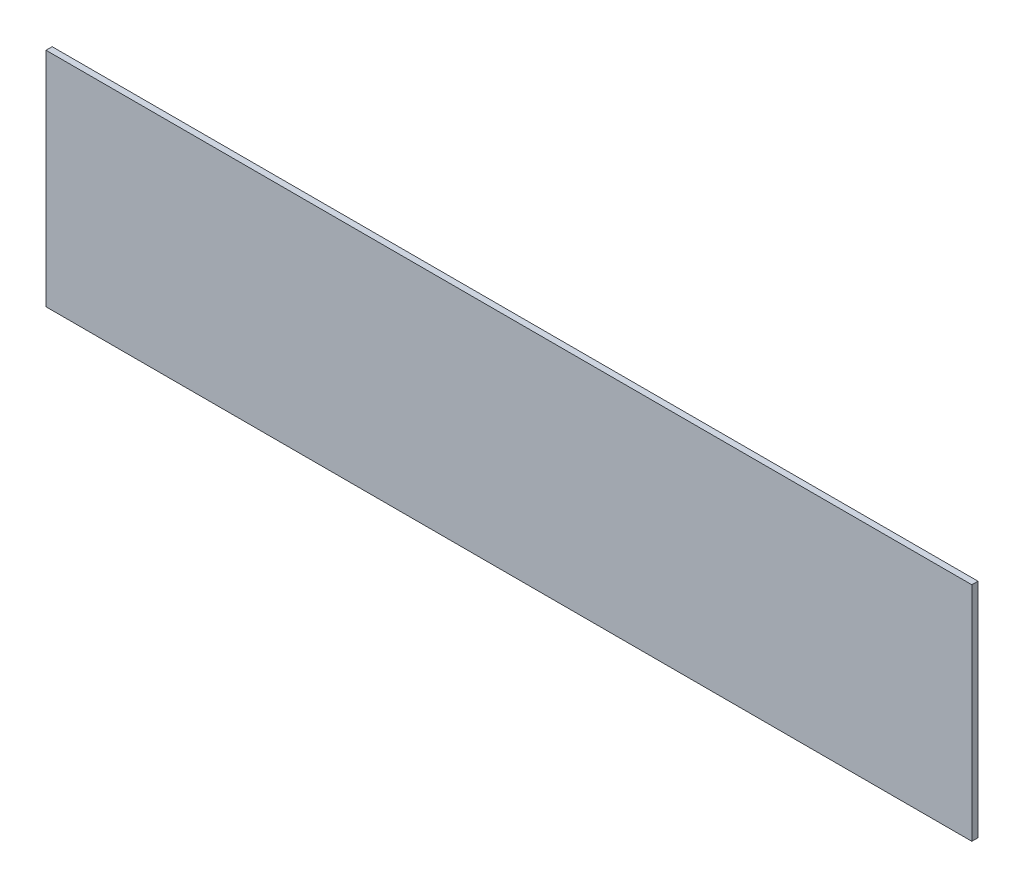
ISO-10303-21;
HEADER;
FILE_DESCRIPTION(('STEP AP214'),'2;1');
FILE_NAME('part.step','',(''),(''),'','','');
FILE_SCHEMA(('AUTOMOTIVE_DESIGN { 1 0 10303 214 1 1 1 1 }'));
ENDSEC;
DATA;
#1=APPLICATION_CONTEXT('core data for automotive mechanical design processes');
#2=APPLICATION_PROTOCOL_DEFINITION('international standard','automotive_design',2000,#1);
#3=PRODUCT_CONTEXT('',#1,'mechanical');
#4=PRODUCT('Part','Part','',(#3));
#5=PRODUCT_RELATED_PRODUCT_CATEGORY('part','',(#4));
#6=PRODUCT_DEFINITION_FORMATION('','',#4);
#7=PRODUCT_DEFINITION_CONTEXT('part definition',#1,'design');
#8=PRODUCT_DEFINITION('design','',#6,#7);
#9=PRODUCT_DEFINITION_SHAPE('','',#8);
#10=(LENGTH_UNIT() NAMED_UNIT(*) SI_UNIT(.MILLI.,.METRE.));
#11=(NAMED_UNIT(*) PLANE_ANGLE_UNIT() SI_UNIT($,.RADIAN.));
#12=(NAMED_UNIT(*) SI_UNIT($,.STERADIAN.) SOLID_ANGLE_UNIT());
#13=UNCERTAINTY_MEASURE_WITH_UNIT(LENGTH_MEASURE(1.E-05),#10,'distance_accuracy_value','');
#14=(GEOMETRIC_REPRESENTATION_CONTEXT(3) GLOBAL_UNCERTAINTY_ASSIGNED_CONTEXT((#13)) GLOBAL_UNIT_ASSIGNED_CONTEXT((#10,
#11,#12)) REPRESENTATION_CONTEXT('',''));
#15=CARTESIAN_POINT('',(0.,0.,0.));
#16=DIRECTION('',(0.,0.,1.));
#17=DIRECTION('',(1.,0.,0.));
#18=AXIS2_PLACEMENT_3D('',#15,#16,#17);
#19=CARTESIAN_POINT('',(-90.361242914173,53.3396271710853,3.175));
#20=DIRECTION('',(1.,0.,0.));
#21=DIRECTION('',(0.,1.,0.));
#22=AXIS2_PLACEMENT_3D('',#19,#20,#21);
#23=PLANE('',#22);
#24=DIRECTION('',(0.,-1.,0.));
#25=VECTOR('',#24,1.);
#26=CARTESIAN_POINT('',(-90.361242914173,53.3396271710853,0.));
#27=LINE('',#26,#25);
#28=CARTESIAN_POINT('',(-90.361242914173,53.3396271710853,0.));
#29=VERTEX_POINT('',#28);
#30=CARTESIAN_POINT('',(-90.361242914173,-60.9603728289147,0.));
#31=VERTEX_POINT('',#30);
#32=EDGE_CURVE('E95',#29,#31,#27,.T.);
#33=ORIENTED_EDGE('',*,*,#32,.T.);
#34=DIRECTION('',(0.,0.,-1.));
#35=VECTOR('',#34,1.);
#36=CARTESIAN_POINT('',(-90.361242914173,-60.9603728289147,3.175));
#37=LINE('',#36,#35);
#38=CARTESIAN_POINT('',(-90.361242914173,-60.9603728289147,3.175));
#39=VERTEX_POINT('',#38);
#40=EDGE_CURVE('E11',#39,#31,#37,.T.);
#41=ORIENTED_EDGE('',*,*,#40,.F.);
#42=DIRECTION('',(0.,-1.,0.));
#43=VECTOR('',#42,1.);
#44=CARTESIAN_POINT('',(-90.361242914173,53.3396271710853,3.175));
#45=LINE('',#44,#43);
#46=CARTESIAN_POINT('',(-90.361242914173,53.3396271710853,3.175));
#47=VERTEX_POINT('',#46);
#48=EDGE_CURVE('E83',#47,#39,#45,.T.);
#49=ORIENTED_EDGE('',*,*,#48,.F.);
#50=DIRECTION('',(0.,0.,-1.));
#51=VECTOR('',#50,1.);
#52=CARTESIAN_POINT('',(-90.361242914173,53.3396271710853,3.175));
#53=LINE('',#52,#51);
#54=EDGE_CURVE('E91',#47,#29,#53,.T.);
#55=ORIENTED_EDGE('',*,*,#54,.T.);
#56=EDGE_LOOP('',(#33,#41,#49,#55));
#57=FACE_BOUND('',#56,.T.);
#58=ADVANCED_FACE('F32',(#57),#23,.F.);
#59=CARTESIAN_POINT('',(-90.361242914173,-60.9603728289147,3.175));
#60=DIRECTION('',(0.,1.,0.));
#61=DIRECTION('',(0.,0.,1.));
#62=AXIS2_PLACEMENT_3D('',#59,#60,#61);
#63=PLANE('',#62);
#64=DIRECTION('',(1.,0.,0.));
#65=VECTOR('',#64,1.);
#66=CARTESIAN_POINT('',(-90.361242914173,-60.9603728289147,0.));
#67=LINE('',#66,#65);
#68=CARTESIAN_POINT('',(385.888757085827,-60.9603728289147,0.));
#69=VERTEX_POINT('',#68);
#70=EDGE_CURVE('E87',#31,#69,#67,.T.);
#71=ORIENTED_EDGE('',*,*,#70,.T.);
#72=DIRECTION('',(0.,0.,-1.));
#73=VECTOR('',#72,1.);
#74=CARTESIAN_POINT('',(385.888757085827,-60.9603728289147,3.175));
#75=LINE('',#74,#73);
#76=CARTESIAN_POINT('',(385.888757085827,-60.9603728289147,3.175));
#77=VERTEX_POINT('',#76);
#78=EDGE_CURVE('E40',#77,#69,#75,.T.);
#79=ORIENTED_EDGE('',*,*,#78,.F.);
#80=DIRECTION('',(1.,0.,0.));
#81=VECTOR('',#80,1.);
#82=CARTESIAN_POINT('',(-90.361242914173,-60.9603728289147,3.175));
#83=LINE('',#82,#81);
#84=EDGE_CURVE('E78',#39,#77,#83,.T.);
#85=ORIENTED_EDGE('',*,*,#84,.F.);
#86=ORIENTED_EDGE('',*,*,#40,.T.);
#87=EDGE_LOOP('',(#71,#79,#85,#86));
#88=FACE_BOUND('',#87,.T.);
#89=ADVANCED_FACE('F86',(#88),#63,.F.);
#90=CARTESIAN_POINT('',(385.888757085827,53.3396271710853,3.175));
#91=DIRECTION('',(-1.,0.,0.));
#92=DIRECTION('',(0.,0.,1.));
#93=AXIS2_PLACEMENT_3D('',#90,#91,#92);
#94=PLANE('',#93);
#95=DIRECTION('',(0.,1.,0.));
#96=VECTOR('',#95,1.);
#97=CARTESIAN_POINT('',(385.888757085827,53.3396271710853,0.));
#98=LINE('',#97,#96);
#99=CARTESIAN_POINT('',(385.888757085827,53.3396271710853,0.));
#100=VERTEX_POINT('',#99);
#101=EDGE_CURVE('E65',#69,#100,#98,.T.);
#102=ORIENTED_EDGE('',*,*,#101,.T.);
#103=DIRECTION('',(0.,0.,-1.));
#104=VECTOR('',#103,1.);
#105=CARTESIAN_POINT('',(385.888757085827,53.3396271710853,3.175));
#106=LINE('',#105,#104);
#107=CARTESIAN_POINT('',(385.888757085827,53.3396271710853,3.175));
#108=VERTEX_POINT('',#107);
#109=EDGE_CURVE('E88',#108,#100,#106,.T.);
#110=ORIENTED_EDGE('',*,*,#109,.F.);
#111=DIRECTION('',(0.,1.,0.));
#112=VECTOR('',#111,1.);
#113=CARTESIAN_POINT('',(385.888757085827,53.3396271710853,3.175));
#114=LINE('',#113,#112);
#115=EDGE_CURVE('E81',#77,#108,#114,.T.);
#116=ORIENTED_EDGE('',*,*,#115,.F.);
#117=ORIENTED_EDGE('',*,*,#78,.T.);
#118=EDGE_LOOP('',(#102,#110,#116,#117));
#119=FACE_BOUND('',#118,.T.);
#120=ADVANCED_FACE('F89',(#119),#94,.F.);
#121=CARTESIAN_POINT('',(-90.361242914173,53.3396271710853,3.175));
#122=DIRECTION('',(0.,-1.,0.));
#123=DIRECTION('',(0.,0.,-1.));
#124=AXIS2_PLACEMENT_3D('',#121,#122,#123);
#125=PLANE('',#124);
#126=DIRECTION('',(-1.,0.,0.));
#127=VECTOR('',#126,1.);
#128=CARTESIAN_POINT('',(-90.361242914173,53.3396271710853,0.));
#129=LINE('',#128,#127);
#130=EDGE_CURVE('E71',#100,#29,#129,.T.);
#131=ORIENTED_EDGE('',*,*,#130,.T.);
#132=ORIENTED_EDGE('',*,*,#54,.F.);
#133=DIRECTION('',(-1.,0.,0.));
#134=VECTOR('',#133,1.);
#135=CARTESIAN_POINT('',(-90.361242914173,53.3396271710853,3.175));
#136=LINE('',#135,#134);
#137=EDGE_CURVE('E48',#108,#47,#136,.T.);
#138=ORIENTED_EDGE('',*,*,#137,.F.);
#139=ORIENTED_EDGE('',*,*,#109,.T.);
#140=EDGE_LOOP('',(#131,#132,#138,#139));
#141=FACE_BOUND('',#140,.T.);
#142=ADVANCED_FACE('F102',(#141),#125,.F.);
#143=CARTESIAN_POINT('',(-90.361242914173,-60.9603728289147,3.175));
#144=DIRECTION('',(0.,0.,1.));
#145=DIRECTION('',(1.,0.,0.));
#146=AXIS2_PLACEMENT_3D('',#143,#144,#145);
#147=PLANE('',#146);
#148=ORIENTED_EDGE('',*,*,#48,.T.);
#149=ORIENTED_EDGE('',*,*,#84,.T.);
#150=ORIENTED_EDGE('',*,*,#115,.T.);
#151=ORIENTED_EDGE('',*,*,#137,.T.);
#152=EDGE_LOOP('',(#148,#149,#150,#151));
#153=FACE_BOUND('',#152,.T.);
#154=ADVANCED_FACE('F79',(#153),#147,.T.);
#155=CARTESIAN_POINT('',(-90.361242914173,-60.9603728289147,0.));
#156=DIRECTION('',(0.,0.,1.));
#157=DIRECTION('',(1.,0.,0.));
#158=AXIS2_PLACEMENT_3D('',#155,#156,#157);
#159=PLANE('',#158);
#160=ORIENTED_EDGE('',*,*,#32,.F.);
#161=ORIENTED_EDGE('',*,*,#130,.F.);
#162=ORIENTED_EDGE('',*,*,#101,.F.);
#163=ORIENTED_EDGE('',*,*,#70,.F.);
#164=EDGE_LOOP('',(#160,#161,#162,#163));
#165=FACE_BOUND('',#164,.T.);
#166=ADVANCED_FACE('F105',(#165),#159,.F.);
#167=CLOSED_SHELL('',(#58,#89,#120,#142,#154,#166));
#168=MANIFOLD_SOLID_BREP('B2',#167);
#169=ADVANCED_BREP_SHAPE_REPRESENTATION('',(#18,#168),#14);
#170=SHAPE_DEFINITION_REPRESENTATION(#9,#169);
ENDSEC;
END-ISO-10303-21;
